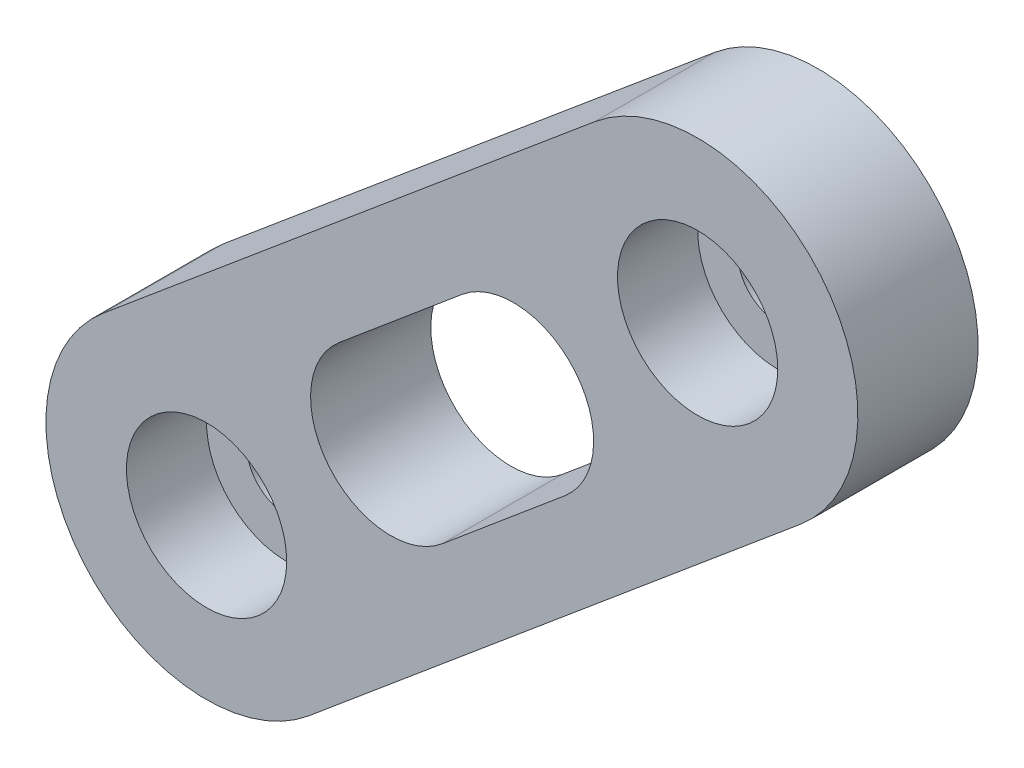
ISO-10303-21;
HEADER;
FILE_DESCRIPTION(('STEP AP214'),'2;1');
FILE_NAME('part.step','',(''),(''),'','','');
FILE_SCHEMA(('AUTOMOTIVE_DESIGN { 1 0 10303 214 1 1 1 1 }'));
ENDSEC;
DATA;
#1=APPLICATION_CONTEXT('core data for automotive mechanical design processes');
#2=APPLICATION_PROTOCOL_DEFINITION('international standard','automotive_design',2000,#1);
#3=PRODUCT_CONTEXT('',#1,'mechanical');
#4=PRODUCT('Part','Part','',(#3));
#5=PRODUCT_RELATED_PRODUCT_CATEGORY('part','',(#4));
#6=PRODUCT_DEFINITION_FORMATION('','',#4);
#7=PRODUCT_DEFINITION_CONTEXT('part definition',#1,'design');
#8=PRODUCT_DEFINITION('design','',#6,#7);
#9=PRODUCT_DEFINITION_SHAPE('','',#8);
#10=(LENGTH_UNIT() NAMED_UNIT(*) SI_UNIT(.MILLI.,.METRE.));
#11=(NAMED_UNIT(*) PLANE_ANGLE_UNIT() SI_UNIT($,.RADIAN.));
#12=(NAMED_UNIT(*) SI_UNIT($,.STERADIAN.) SOLID_ANGLE_UNIT());
#13=UNCERTAINTY_MEASURE_WITH_UNIT(LENGTH_MEASURE(1.E-05),#10,'distance_accuracy_value','');
#14=(GEOMETRIC_REPRESENTATION_CONTEXT(3) GLOBAL_UNCERTAINTY_ASSIGNED_CONTEXT((#13)) GLOBAL_UNIT_ASSIGNED_CONTEXT((#10,
#11,#12)) REPRESENTATION_CONTEXT('',''));
#15=CARTESIAN_POINT('',(0.,0.,0.));
#16=DIRECTION('',(0.,0.,1.));
#17=DIRECTION('',(1.,0.,0.));
#18=AXIS2_PLACEMENT_3D('',#15,#16,#17);
#19=CARTESIAN_POINT('',(432.405497453474,355.964528743967,19.05));
#20=DIRECTION('',(0.,0.,-1.));
#21=DIRECTION('',(-1.,0.,0.));
#22=AXIS2_PLACEMENT_3D('',#19,#20,#21);
#23=CYLINDRICAL_SURFACE('',#22,6.34999999999999);
#24=CARTESIAN_POINT('',(432.405497453474,355.964528743967,0.));
#25=DIRECTION('',(0.,0.,1.));
#26=DIRECTION('',(1.,0.,0.));
#27=AXIS2_PLACEMENT_3D('',#24,#25,#26);
#28=CIRCLE('',#27,6.34999999999999);
#29=CARTESIAN_POINT('',(426.055497453474,355.964528743967,0.));
#30=VERTEX_POINT('',#29);
#31=EDGE_CURVE('E125',#30,#30,#28,.T.);
#32=CARTESIAN_POINT('',(432.405497453474,355.964528743967,6.35));
#33=DIRECTION('',(0.,0.,1.));
#34=DIRECTION('',(1.,0.,0.));
#35=AXIS2_PLACEMENT_3D('',#32,#33,#34);
#36=CIRCLE('',#35,6.34999999999999);
#37=CARTESIAN_POINT('',(426.055497453474,355.964528743967,6.35));
#38=VERTEX_POINT('',#37);
#39=EDGE_CURVE('E43',#38,#38,#36,.T.);
#40=CARTESIAN_POINT('',(426.055497453474,355.964528743967,0.));
#41=CARTESIAN_POINT('',(426.055497453474,355.964528743967,0.0661458333333329));
#42=CARTESIAN_POINT('',(426.055497453474,355.964528743967,0.132291666666666));
#43=CARTESIAN_POINT('',(426.055497453474,355.964528743967,0.264583333333333));
#44=CARTESIAN_POINT('',(426.055497453474,355.964528743967,0.330729166666667));
#45=CARTESIAN_POINT('',(426.055497453474,355.964528743967,0.463020833333334));
#46=CARTESIAN_POINT('',(426.055497453474,355.964528743967,0.529166666666667));
#47=CARTESIAN_POINT('',(426.055497453474,355.964528743967,0.661458333333333));
#48=CARTESIAN_POINT('',(426.055497453474,355.964528743967,0.727604166666666));
#49=CARTESIAN_POINT('',(426.055497453474,355.964528743967,0.859895833333334));
#50=CARTESIAN_POINT('',(426.055497453474,355.964528743967,0.926041666666668));
#51=CARTESIAN_POINT('',(426.055497453474,355.964528743967,1.05833333333333));
#52=CARTESIAN_POINT('',(426.055497453474,355.964528743967,1.12447916666667));
#53=CARTESIAN_POINT('',(426.055497453474,355.964528743967,1.25677083333333));
#54=CARTESIAN_POINT('',(426.055497453474,355.964528743967,1.32291666666667));
#55=CARTESIAN_POINT('',(426.055497453474,355.964528743967,1.45520833333333));
#56=CARTESIAN_POINT('',(426.055497453474,355.964528743967,1.52135416666667));
#57=CARTESIAN_POINT('',(426.055497453474,355.964528743967,1.65364583333333));
#58=CARTESIAN_POINT('',(426.055497453474,355.964528743967,1.71979166666667));
#59=CARTESIAN_POINT('',(426.055497453474,355.964528743967,1.85208333333333));
#60=CARTESIAN_POINT('',(426.055497453474,355.964528743967,1.91822916666667));
#61=CARTESIAN_POINT('',(426.055497453474,355.964528743967,2.05052083333333));
#62=CARTESIAN_POINT('',(426.055497453474,355.964528743967,2.11666666666667));
#63=CARTESIAN_POINT('',(426.055497453474,355.964528743967,2.24895833333333));
#64=CARTESIAN_POINT('',(426.055497453474,355.964528743967,2.31510416666667));
#65=CARTESIAN_POINT('',(426.055497453474,355.964528743967,2.44739583333333));
#66=CARTESIAN_POINT('',(426.055497453474,355.964528743967,2.51354166666667));
#67=CARTESIAN_POINT('',(426.055497453474,355.964528743967,2.64583333333333));
#68=CARTESIAN_POINT('',(426.055497453474,355.964528743967,2.71197916666667));
#69=CARTESIAN_POINT('',(426.055497453474,355.964528743967,2.84427083333333));
#70=CARTESIAN_POINT('',(426.055497453474,355.964528743967,2.91041666666667));
#71=CARTESIAN_POINT('',(426.055497453474,355.964528743967,3.04270833333333));
#72=CARTESIAN_POINT('',(426.055497453474,355.964528743967,3.10885416666667));
#73=CARTESIAN_POINT('',(426.055497453474,355.964528743967,3.24114583333333));
#74=CARTESIAN_POINT('',(426.055497453474,355.964528743967,3.30729166666667));
#75=CARTESIAN_POINT('',(426.055497453474,355.964528743967,3.43958333333333));
#76=CARTESIAN_POINT('',(426.055497453474,355.964528743967,3.50572916666667));
#77=CARTESIAN_POINT('',(426.055497453474,355.964528743967,3.63802083333333));
#78=CARTESIAN_POINT('',(426.055497453474,355.964528743967,3.70416666666667));
#79=CARTESIAN_POINT('',(426.055497453474,355.964528743967,3.83645833333333));
#80=CARTESIAN_POINT('',(426.055497453474,355.964528743967,3.90260416666667));
#81=CARTESIAN_POINT('',(426.055497453474,355.964528743967,4.03489583333333));
#82=CARTESIAN_POINT('',(426.055497453474,355.964528743967,4.10104166666667));
#83=CARTESIAN_POINT('',(426.055497453474,355.964528743967,4.23333333333333));
#84=CARTESIAN_POINT('',(426.055497453474,355.964528743967,4.29947916666667));
#85=CARTESIAN_POINT('',(426.055497453474,355.964528743967,4.43177083333333));
#86=CARTESIAN_POINT('',(426.055497453474,355.964528743967,4.49791666666667));
#87=CARTESIAN_POINT('',(426.055497453474,355.964528743967,4.63020833333333));
#88=CARTESIAN_POINT('',(426.055497453474,355.964528743967,4.69635416666667));
#89=CARTESIAN_POINT('',(426.055497453474,355.964528743967,4.82864583333333));
#90=CARTESIAN_POINT('',(426.055497453474,355.964528743967,4.89479166666667));
#91=CARTESIAN_POINT('',(426.055497453474,355.964528743967,5.02708333333333));
#92=CARTESIAN_POINT('',(426.055497453474,355.964528743967,5.09322916666667));
#93=CARTESIAN_POINT('',(426.055497453474,355.964528743967,5.22552083333333));
#94=CARTESIAN_POINT('',(426.055497453474,355.964528743967,5.29166666666667));
#95=CARTESIAN_POINT('',(426.055497453474,355.964528743967,5.42395833333333));
#96=CARTESIAN_POINT('',(426.055497453474,355.964528743967,5.49010416666667));
#97=CARTESIAN_POINT('',(426.055497453474,355.964528743967,5.62239583333333));
#98=CARTESIAN_POINT('',(426.055497453474,355.964528743967,5.68854166666667));
#99=CARTESIAN_POINT('',(426.055497453474,355.964528743967,5.82083333333333));
#100=CARTESIAN_POINT('',(426.055497453474,355.964528743967,5.88697916666667));
#101=CARTESIAN_POINT('',(426.055497453474,355.964528743967,6.01927083333333));
#102=CARTESIAN_POINT('',(426.055497453474,355.964528743967,6.08541666666667));
#103=CARTESIAN_POINT('',(426.055497453474,355.964528743967,6.21770833333333));
#104=CARTESIAN_POINT('',(426.055497453474,355.964528743967,6.28385416666667));
#105=CARTESIAN_POINT('',(426.055497453474,355.964528743967,6.35));
#106=B_SPLINE_CURVE_WITH_KNOTS('',3,(#40,#41,#42,#43,#44,#45,#46,#47,#48,#49,#50,#51,#52,#53,
#54,#55,#56,#57,#58,#59,#60,#61,#62,#63,#64,#65,#66,#67,#68,#69,#70,#71,#72,#73,#74,#75,#76,#77,
#78,#79,#80,#81,#82,#83,#84,#85,#86,#87,#88,#89,#90,#91,#92,#93,#94,#95,#96,#97,#98,#99,#100,
#101,#102,#103,#104,#105),.UNSPECIFIED.,.F.,.F.,(4,2,2,2,2,2,2,2,2,2,2,2,2,2,2,2,2,2,2,2,2,2,2,
2,2,2,2,2,2,2,2,2,4),(0.,0.198437499999999,0.396875000000001,0.5953125,0.793749999999999,
0.992187500000002,1.190625,1.3890625,1.5875,1.7859375,1.984375,2.1828125,2.38125,2.5796875,
2.778125,2.9765625,3.175,3.3734375,3.571875,3.7703125,3.96875,4.1671875,4.365625,4.5640625,
4.7625,4.9609375,5.159375,5.3578125,5.55625,5.7546875,5.953125,6.1515625,6.35),.UNSPECIFIED.);
#107=EDGE_CURVE('BSEAM39',#30,#38,#106,.T.);
#108=ORIENTED_EDGE('',*,*,#31,.F.);
#109=ORIENTED_EDGE('',*,*,#39,.T.);
#110=ORIENTED_EDGE('',*,*,#107,.T.);
#111=ORIENTED_EDGE('',*,*,#107,.F.);
#112=EDGE_LOOP('',(#108,#110,#109,#111));
#113=FACE_BOUND('',#112,.T.);
#114=ADVANCED_FACE('F39',(#113),#23,.F.);
#115=CARTESIAN_POINT('',(354.575405537633,290.65732732289,19.05));
#116=DIRECTION('',(0.,0.,-1.));
#117=DIRECTION('',(-1.,0.,0.));
#118=AXIS2_PLACEMENT_3D('',#115,#116,#117);
#119=CYLINDRICAL_SURFACE('',#118,6.34999999999999);
#120=CARTESIAN_POINT('',(354.575405537633,290.65732732289,0.));
#121=DIRECTION('',(0.,0.,1.));
#122=DIRECTION('',(1.,0.,0.));
#123=AXIS2_PLACEMENT_3D('',#120,#121,#122);
#124=CIRCLE('',#123,6.34999999999999);
#125=CARTESIAN_POINT('',(348.225405537633,290.65732732289,0.));
#126=VERTEX_POINT('',#125);
#127=EDGE_CURVE('E143',#126,#126,#124,.T.);
#128=CARTESIAN_POINT('',(354.575405537633,290.65732732289,6.35));
#129=DIRECTION('',(0.,0.,1.));
#130=DIRECTION('',(1.,0.,0.));
#131=AXIS2_PLACEMENT_3D('',#128,#129,#130);
#132=CIRCLE('',#131,6.34999999999999);
#133=CARTESIAN_POINT('',(348.225405537633,290.65732732289,6.35));
#134=VERTEX_POINT('',#133);
#135=EDGE_CURVE('E198',#134,#134,#132,.T.);
#136=CARTESIAN_POINT('',(348.225405537633,290.65732732289,0.));
#137=CARTESIAN_POINT('',(348.225405537633,290.65732732289,0.0661458333333329));
#138=CARTESIAN_POINT('',(348.225405537633,290.65732732289,0.132291666666666));
#139=CARTESIAN_POINT('',(348.225405537633,290.65732732289,0.264583333333333));
#140=CARTESIAN_POINT('',(348.225405537633,290.65732732289,0.330729166666667));
#141=CARTESIAN_POINT('',(348.225405537633,290.65732732289,0.463020833333334));
#142=CARTESIAN_POINT('',(348.225405537633,290.65732732289,0.529166666666667));
#143=CARTESIAN_POINT('',(348.225405537633,290.65732732289,0.661458333333333));
#144=CARTESIAN_POINT('',(348.225405537633,290.65732732289,0.727604166666666));
#145=CARTESIAN_POINT('',(348.225405537633,290.65732732289,0.859895833333334));
#146=CARTESIAN_POINT('',(348.225405537633,290.65732732289,0.926041666666668));
#147=CARTESIAN_POINT('',(348.225405537633,290.65732732289,1.05833333333333));
#148=CARTESIAN_POINT('',(348.225405537633,290.65732732289,1.12447916666667));
#149=CARTESIAN_POINT('',(348.225405537633,290.65732732289,1.25677083333333));
#150=CARTESIAN_POINT('',(348.225405537633,290.65732732289,1.32291666666667));
#151=CARTESIAN_POINT('',(348.225405537633,290.65732732289,1.45520833333333));
#152=CARTESIAN_POINT('',(348.225405537633,290.65732732289,1.52135416666667));
#153=CARTESIAN_POINT('',(348.225405537633,290.65732732289,1.65364583333333));
#154=CARTESIAN_POINT('',(348.225405537633,290.65732732289,1.71979166666667));
#155=CARTESIAN_POINT('',(348.225405537633,290.65732732289,1.85208333333333));
#156=CARTESIAN_POINT('',(348.225405537633,290.65732732289,1.91822916666667));
#157=CARTESIAN_POINT('',(348.225405537633,290.65732732289,2.05052083333333));
#158=CARTESIAN_POINT('',(348.225405537633,290.65732732289,2.11666666666667));
#159=CARTESIAN_POINT('',(348.225405537633,290.65732732289,2.24895833333333));
#160=CARTESIAN_POINT('',(348.225405537633,290.65732732289,2.31510416666667));
#161=CARTESIAN_POINT('',(348.225405537633,290.65732732289,2.44739583333333));
#162=CARTESIAN_POINT('',(348.225405537633,290.65732732289,2.51354166666667));
#163=CARTESIAN_POINT('',(348.225405537633,290.65732732289,2.64583333333333));
#164=CARTESIAN_POINT('',(348.225405537633,290.65732732289,2.71197916666667));
#165=CARTESIAN_POINT('',(348.225405537633,290.65732732289,2.84427083333333));
#166=CARTESIAN_POINT('',(348.225405537633,290.65732732289,2.91041666666667));
#167=CARTESIAN_POINT('',(348.225405537633,290.65732732289,3.04270833333333));
#168=CARTESIAN_POINT('',(348.225405537633,290.65732732289,3.10885416666667));
#169=CARTESIAN_POINT('',(348.225405537633,290.65732732289,3.24114583333333));
#170=CARTESIAN_POINT('',(348.225405537633,290.65732732289,3.30729166666667));
#171=CARTESIAN_POINT('',(348.225405537633,290.65732732289,3.43958333333333));
#172=CARTESIAN_POINT('',(348.225405537633,290.65732732289,3.50572916666667));
#173=CARTESIAN_POINT('',(348.225405537633,290.65732732289,3.63802083333333));
#174=CARTESIAN_POINT('',(348.225405537633,290.65732732289,3.70416666666667));
#175=CARTESIAN_POINT('',(348.225405537633,290.65732732289,3.83645833333333));
#176=CARTESIAN_POINT('',(348.225405537633,290.65732732289,3.90260416666667));
#177=CARTESIAN_POINT('',(348.225405537633,290.65732732289,4.03489583333333));
#178=CARTESIAN_POINT('',(348.225405537633,290.65732732289,4.10104166666667));
#179=CARTESIAN_POINT('',(348.225405537633,290.65732732289,4.23333333333333));
#180=CARTESIAN_POINT('',(348.225405537633,290.65732732289,4.29947916666667));
#181=CARTESIAN_POINT('',(348.225405537633,290.65732732289,4.43177083333333));
#182=CARTESIAN_POINT('',(348.225405537633,290.65732732289,4.49791666666667));
#183=CARTESIAN_POINT('',(348.225405537633,290.65732732289,4.63020833333333));
#184=CARTESIAN_POINT('',(348.225405537633,290.65732732289,4.69635416666667));
#185=CARTESIAN_POINT('',(348.225405537633,290.65732732289,4.82864583333333));
#186=CARTESIAN_POINT('',(348.225405537633,290.65732732289,4.89479166666667));
#187=CARTESIAN_POINT('',(348.225405537633,290.65732732289,5.02708333333333));
#188=CARTESIAN_POINT('',(348.225405537633,290.65732732289,5.09322916666667));
#189=CARTESIAN_POINT('',(348.225405537633,290.65732732289,5.22552083333333));
#190=CARTESIAN_POINT('',(348.225405537633,290.65732732289,5.29166666666667));
#191=CARTESIAN_POINT('',(348.225405537633,290.65732732289,5.42395833333333));
#192=CARTESIAN_POINT('',(348.225405537633,290.65732732289,5.49010416666667));
#193=CARTESIAN_POINT('',(348.225405537633,290.65732732289,5.62239583333333));
#194=CARTESIAN_POINT('',(348.225405537633,290.65732732289,5.68854166666667));
#195=CARTESIAN_POINT('',(348.225405537633,290.65732732289,5.82083333333333));
#196=CARTESIAN_POINT('',(348.225405537633,290.65732732289,5.88697916666667));
#197=CARTESIAN_POINT('',(348.225405537633,290.65732732289,6.01927083333333));
#198=CARTESIAN_POINT('',(348.225405537633,290.65732732289,6.08541666666667));
#199=CARTESIAN_POINT('',(348.225405537633,290.65732732289,6.21770833333333));
#200=CARTESIAN_POINT('',(348.225405537633,290.65732732289,6.28385416666667));
#201=CARTESIAN_POINT('',(348.225405537633,290.65732732289,6.35));
#202=B_SPLINE_CURVE_WITH_KNOTS('',3,(#136,#137,#138,#139,#140,#141,#142,#143,#144,#145,#146,
#147,#148,#149,#150,#151,#152,#153,#154,#155,#156,#157,#158,#159,#160,#161,#162,#163,#164,#165,
#166,#167,#168,#169,#170,#171,#172,#173,#174,#175,#176,#177,#178,#179,#180,#181,#182,#183,#184,
#185,#186,#187,#188,#189,#190,#191,#192,#193,#194,#195,#196,#197,#198,#199,#200,#201),
.UNSPECIFIED.,.F.,.F.,(4,2,2,2,2,2,2,2,2,2,2,2,2,2,2,2,2,2,2,2,2,2,2,2,2,2,2,2,2,2,2,2,4),(0.,
0.198437499999999,0.396875000000001,0.5953125,0.793749999999999,0.992187500000002,1.190625,
1.3890625,1.5875,1.7859375,1.984375,2.1828125,2.38125,2.5796875,2.778125,2.9765625,3.175,
3.3734375,3.571875,3.7703125,3.96875,4.1671875,4.365625,4.5640625,4.7625,4.9609375,5.159375,
5.3578125,5.55625,5.7546875,5.953125,6.1515625,6.35),.UNSPECIFIED.);
#203=EDGE_CURVE('BSEAM229',#126,#134,#202,.T.);
#204=ORIENTED_EDGE('',*,*,#127,.F.);
#205=ORIENTED_EDGE('',*,*,#135,.T.);
#206=ORIENTED_EDGE('',*,*,#203,.T.);
#207=ORIENTED_EDGE('',*,*,#203,.F.);
#208=EDGE_LOOP('',(#204,#206,#205,#207));
#209=FACE_BOUND('',#208,.T.);
#210=ADVANCED_FACE('F229',(#209),#119,.F.);
#211=CARTESIAN_POINT('',(354.51118308779,290.734021218523,19.05));
#212=DIRECTION('',(0.,0.,1.));
#213=DIRECTION('',(1.,0.,0.));
#214=AXIS2_PLACEMENT_3D('',#211,#212,#213);
#215=PLANE('',#214);
#216=CARTESIAN_POINT('',(354.575405537633,290.65732732289,19.05));
#217=DIRECTION('',(0.,0.,1.));
#218=DIRECTION('',(1.,0.,0.));
#219=AXIS2_PLACEMENT_3D('',#216,#217,#218);
#220=CIRCLE('',#219,12.7);
#221=CARTESIAN_POINT('',(367.275405537633,290.65732732289,19.05));
#222=VERTEX_POINT('',#221);
#223=EDGE_CURVE('E208',#222,#222,#220,.T.);
#224=ORIENTED_EDGE('',*,*,#223,.F.);
#225=EDGE_LOOP('',(#224));
#226=FACE_BOUND('',#225,.T.);
#227=CARTESIAN_POINT('',(432.405497453474,355.964528743967,19.05));
#228=DIRECTION('',(0.,0.,1.));
#229=DIRECTION('',(1.,0.,0.));
#230=AXIS2_PLACEMENT_3D('',#227,#228,#229);
#231=CIRCLE('',#230,12.7);
#232=CARTESIAN_POINT('',(445.105497453474,355.964528743967,19.05));
#233=VERTEX_POINT('',#232);
#234=EDGE_CURVE('E220',#233,#233,#231,.T.);
#235=ORIENTED_EDGE('',*,*,#234,.F.);
#236=EDGE_LOOP('',(#235));
#237=FACE_BOUND('',#236,.T.);
#238=DIRECTION('',(-0.766044443118981,-0.642787609686536,0.));
#239=VECTOR('',#238,1.);
#240=CARTESIAN_POINT('',(395.055801527622,341.20308524252,19.05));
#241=LINE('',#240,#239);
#242=CARTESIAN_POINT('',(395.055801527622,341.20308524252,19.05));
#243=VERTEX_POINT('',#242);
#244=CARTESIAN_POINT('',(375.5982726724,324.876279956482,19.05));
#245=VERTEX_POINT('',#244);
#246=EDGE_CURVE('E116',#243,#245,#241,.T.);
#247=ORIENTED_EDGE('',*,*,#246,.F.);
#248=CARTESIAN_POINT('',(403.219204170641,331.474320814909,19.05));
#249=DIRECTION('',(0.,0.,1.));
#250=DIRECTION('',(1.,0.,0.));
#251=AXIS2_PLACEMENT_3D('',#248,#249,#250);
#252=CIRCLE('',#251,12.6999999999999);
#253=CARTESIAN_POINT('',(411.38260681366,321.745556387298,19.05));
#254=VERTEX_POINT('',#253);
#255=EDGE_CURVE('E107',#254,#243,#252,.T.);
#256=ORIENTED_EDGE('',*,*,#255,.F.);
#257=DIRECTION('',(0.766044443118977,0.642787609686541,0.));
#258=VECTOR('',#257,1.);
#259=CARTESIAN_POINT('',(411.38260681366,321.745556387298,19.05));
#260=LINE('',#259,#258);
#261=CARTESIAN_POINT('',(391.925077958438,305.41875110126,19.05));
#262=VERTEX_POINT('',#261);
#263=EDGE_CURVE('E135',#262,#254,#260,.T.);
#264=ORIENTED_EDGE('',*,*,#263,.F.);
#265=CARTESIAN_POINT('',(383.761675315419,315.147515528871,19.05));
#266=DIRECTION('',(0.,0.,1.));
#267=DIRECTION('',(1.,0.,0.));
#268=AXIS2_PLACEMENT_3D('',#265,#266,#267);
#269=CIRCLE('',#268,12.7);
#270=EDGE_CURVE('E131',#245,#262,#269,.T.);
#271=ORIENTED_EDGE('',*,*,#270,.F.);
#272=EDGE_LOOP('',(#247,#256,#264,#271));
#273=FACE_BOUND('',#272,.T.);
#274=CARTESIAN_POINT('',(354.51118308779,290.734021218523,19.05));
#275=DIRECTION('',(0.,0.,1.));
#276=DIRECTION('',(1.,0.,0.));
#277=AXIS2_PLACEMENT_3D('',#274,#275,#276);
#278=CIRCLE('',#277,25.4000000000002);
#279=CARTESIAN_POINT('',(338.203539729169,310.207612774476,19.05));
#280=VERTEX_POINT('',#279);
#281=CARTESIAN_POINT('',(370.81882314274,271.260426896001,19.05));
#282=VERTEX_POINT('',#281);
#283=EDGE_CURVE('E163',#280,#282,#278,.T.);
#284=ORIENTED_EDGE('',*,*,#283,.T.);
#285=DIRECTION('',(0.766676941831592,0.642033073029542,0.));
#286=VECTOR('',#285,1.);
#287=CARTESIAN_POINT('',(448.713137508425,336.490934421444,19.05));
#288=LINE('',#287,#286);
#289=CARTESIAN_POINT('',(448.713137508425,336.490934421444,19.05));
#290=VERTEX_POINT('',#289);
#291=EDGE_CURVE('E167',#282,#290,#288,.T.);
#292=ORIENTED_EDGE('',*,*,#291,.T.);
#293=CARTESIAN_POINT('',(432.405497453474,355.964528743967,19.05));
#294=DIRECTION('',(0.,0.,1.));
#295=DIRECTION('',(-1.,0.,0.));
#296=AXIS2_PLACEMENT_3D('',#293,#294,#295);
#297=CIRCLE('',#296,25.4000000000001);
#298=CARTESIAN_POINT('',(416.097857398524,375.438123066489,19.05));
#299=VERTEX_POINT('',#298);
#300=EDGE_CURVE('E171',#290,#299,#297,.T.);
#301=ORIENTED_EDGE('',*,*,#300,.T.);
#302=DIRECTION('',(-0.766676941831591,-0.642033073029543,0.));
#303=VECTOR('',#302,1.);
#304=CARTESIAN_POINT('',(416.097857398524,375.438123066489,19.05));
#305=LINE('',#304,#303);
#306=EDGE_CURVE('E174',#299,#280,#305,.T.);
#307=ORIENTED_EDGE('',*,*,#306,.T.);
#308=EDGE_LOOP('',(#284,#292,#301,#307));
#309=FACE_BOUND('',#308,.T.);
#310=ADVANCED_FACE('F129',(#226,#237,#273,#309),#215,.T.);
#311=CARTESIAN_POINT('',(354.51118308779,290.734021218523,0.));
#312=DIRECTION('',(0.,0.,1.));
#313=DIRECTION('',(1.,0.,0.));
#314=AXIS2_PLACEMENT_3D('',#311,#312,#313);
#315=PLANE('',#314);
#316=ORIENTED_EDGE('',*,*,#31,.T.);
#317=EDGE_LOOP('',(#316));
#318=FACE_BOUND('',#317,.T.);
#319=CARTESIAN_POINT('',(354.51118308779,290.734021218523,0.));
#320=DIRECTION('',(0.,0.,1.));
#321=DIRECTION('',(1.,0.,0.));
#322=AXIS2_PLACEMENT_3D('',#319,#320,#321);
#323=CIRCLE('',#322,25.4000000000002);
#324=CARTESIAN_POINT('',(338.203539729169,310.207612774476,0.));
#325=VERTEX_POINT('',#324);
#326=CARTESIAN_POINT('',(370.81882314274,271.260426896001,0.));
#327=VERTEX_POINT('',#326);
#328=EDGE_CURVE('E162',#325,#327,#323,.T.);
#329=ORIENTED_EDGE('',*,*,#328,.F.);
#330=DIRECTION('',(-0.766676941831591,-0.642033073029543,0.));
#331=VECTOR('',#330,1.);
#332=CARTESIAN_POINT('',(416.097857398524,375.438123066489,0.));
#333=LINE('',#332,#331);
#334=CARTESIAN_POINT('',(416.097857398524,375.438123066489,0.));
#335=VERTEX_POINT('',#334);
#336=EDGE_CURVE('E168',#335,#325,#333,.T.);
#337=ORIENTED_EDGE('',*,*,#336,.F.);
#338=CARTESIAN_POINT('',(432.405497453474,355.964528743967,0.));
#339=DIRECTION('',(0.,0.,1.));
#340=DIRECTION('',(-1.,0.,0.));
#341=AXIS2_PLACEMENT_3D('',#338,#339,#340);
#342=CIRCLE('',#341,25.4000000000001);
#343=CARTESIAN_POINT('',(448.713137508425,336.490934421444,0.));
#344=VERTEX_POINT('',#343);
#345=EDGE_CURVE('E184',#344,#335,#342,.T.);
#346=ORIENTED_EDGE('',*,*,#345,.F.);
#347=DIRECTION('',(0.766676941831592,0.642033073029542,0.));
#348=VECTOR('',#347,1.);
#349=CARTESIAN_POINT('',(448.713137508425,336.490934421444,0.));
#350=LINE('',#349,#348);
#351=EDGE_CURVE('E181',#327,#344,#350,.T.);
#352=ORIENTED_EDGE('',*,*,#351,.F.);
#353=EDGE_LOOP('',(#329,#337,#346,#352));
#354=FACE_BOUND('',#353,.T.);
#355=CARTESIAN_POINT('',(403.219204170641,331.474320814909,0.));
#356=DIRECTION('',(0.,0.,1.));
#357=DIRECTION('',(1.,0.,0.));
#358=AXIS2_PLACEMENT_3D('',#355,#356,#357);
#359=CIRCLE('',#358,12.6999999999999);
#360=CARTESIAN_POINT('',(411.38260681366,321.745556387298,0.));
#361=VERTEX_POINT('',#360);
#362=CARTESIAN_POINT('',(395.055801527622,341.20308524252,0.));
#363=VERTEX_POINT('',#362);
#364=EDGE_CURVE('E65',#361,#363,#359,.T.);
#365=ORIENTED_EDGE('',*,*,#364,.T.);
#366=DIRECTION('',(-0.766044443118981,-0.642787609686536,0.));
#367=VECTOR('',#366,1.);
#368=CARTESIAN_POINT('',(395.055801527622,341.20308524252,0.));
#369=LINE('',#368,#367);
#370=CARTESIAN_POINT('',(375.5982726724,324.876279956482,0.));
#371=VERTEX_POINT('',#370);
#372=EDGE_CURVE('E123',#363,#371,#369,.T.);
#373=ORIENTED_EDGE('',*,*,#372,.T.);
#374=CARTESIAN_POINT('',(383.761675315419,315.147515528871,0.));
#375=DIRECTION('',(0.,0.,1.));
#376=DIRECTION('',(1.,0.,0.));
#377=AXIS2_PLACEMENT_3D('',#374,#375,#376);
#378=CIRCLE('',#377,12.7);
#379=CARTESIAN_POINT('',(391.925077958438,305.41875110126,0.));
#380=VERTEX_POINT('',#379);
#381=EDGE_CURVE('E146',#371,#380,#378,.T.);
#382=ORIENTED_EDGE('',*,*,#381,.T.);
#383=DIRECTION('',(0.766044443118977,0.642787609686541,0.));
#384=VECTOR('',#383,1.);
#385=CARTESIAN_POINT('',(411.38260681366,321.745556387298,0.));
#386=LINE('',#385,#384);
#387=EDGE_CURVE('E117',#380,#361,#386,.T.);
#388=ORIENTED_EDGE('',*,*,#387,.T.);
#389=EDGE_LOOP('',(#365,#373,#382,#388));
#390=FACE_BOUND('',#389,.T.);
#391=ORIENTED_EDGE('',*,*,#127,.T.);
#392=EDGE_LOOP('',(#391));
#393=FACE_BOUND('',#392,.T.);
#394=ADVANCED_FACE('F227',(#318,#354,#390,#393),#315,.F.);
#395=CARTESIAN_POINT('',(354.51118308779,290.734021218523,19.05));
#396=DIRECTION('',(0.,0.,-1.));
#397=DIRECTION('',(-1.,0.,0.));
#398=AXIS2_PLACEMENT_3D('',#395,#396,#397);
#399=CYLINDRICAL_SURFACE('',#398,25.4000000000002);
#400=ORIENTED_EDGE('',*,*,#328,.T.);
#401=DIRECTION('',(0.,0.,-1.));
#402=VECTOR('',#401,1.);
#403=CARTESIAN_POINT('',(370.81882314274,271.260426896001,19.05));
#404=LINE('',#403,#402);
#405=EDGE_CURVE('E11',#282,#327,#404,.T.);
#406=ORIENTED_EDGE('',*,*,#405,.F.);
#407=ORIENTED_EDGE('',*,*,#283,.F.);
#408=DIRECTION('',(0.,0.,-1.));
#409=VECTOR('',#408,1.);
#410=CARTESIAN_POINT('',(338.203539729169,310.207612774476,19.05));
#411=LINE('',#410,#409);
#412=EDGE_CURVE('E177',#280,#325,#411,.T.);
#413=ORIENTED_EDGE('',*,*,#412,.T.);
#414=EDGE_LOOP('',(#400,#406,#407,#413));
#415=FACE_BOUND('',#414,.T.);
#416=ADVANCED_FACE('F41',(#415),#399,.T.);
#417=CARTESIAN_POINT('',(448.713137508425,336.490934421444,19.05));
#418=DIRECTION('',(-0.642033073029542,0.766676941831592,0.));
#419=DIRECTION('',(-0.766676941831592,-0.642033073029542,0.));
#420=AXIS2_PLACEMENT_3D('',#417,#418,#419);
#421=PLANE('',#420);
#422=ORIENTED_EDGE('',*,*,#351,.T.);
#423=DIRECTION('',(0.,0.,-1.));
#424=VECTOR('',#423,1.);
#425=CARTESIAN_POINT('',(448.713137508425,336.490934421444,19.05));
#426=LINE('',#425,#424);
#427=EDGE_CURVE('E49',#290,#344,#426,.T.);
#428=ORIENTED_EDGE('',*,*,#427,.F.);
#429=ORIENTED_EDGE('',*,*,#291,.F.);
#430=ORIENTED_EDGE('',*,*,#405,.T.);
#431=EDGE_LOOP('',(#422,#428,#429,#430));
#432=FACE_BOUND('',#431,.T.);
#433=ADVANCED_FACE('F265',(#432),#421,.F.);
#434=CARTESIAN_POINT('',(432.405497453474,355.964528743967,19.05));
#435=DIRECTION('',(0.,0.,-1.));
#436=DIRECTION('',(-1.,0.,0.));
#437=AXIS2_PLACEMENT_3D('',#434,#435,#436);
#438=CYLINDRICAL_SURFACE('',#437,25.4000000000001);
#439=ORIENTED_EDGE('',*,*,#345,.T.);
#440=DIRECTION('',(0.,0.,-1.));
#441=VECTOR('',#440,1.);
#442=CARTESIAN_POINT('',(416.097857398524,375.438123066489,19.05));
#443=LINE('',#442,#441);
#444=EDGE_CURVE('E192',#299,#335,#443,.T.);
#445=ORIENTED_EDGE('',*,*,#444,.F.);
#446=ORIENTED_EDGE('',*,*,#300,.F.);
#447=ORIENTED_EDGE('',*,*,#427,.T.);
#448=EDGE_LOOP('',(#439,#445,#446,#447));
#449=FACE_BOUND('',#448,.T.);
#450=ADVANCED_FACE('F262',(#449),#438,.T.);
#451=CARTESIAN_POINT('',(416.097857398524,375.438123066489,19.05));
#452=DIRECTION('',(0.642033073029543,-0.766676941831591,0.));
#453=DIRECTION('',(0.766676941831591,0.642033073029543,0.));
#454=AXIS2_PLACEMENT_3D('',#451,#452,#453);
#455=PLANE('',#454);
#456=ORIENTED_EDGE('',*,*,#336,.T.);
#457=ORIENTED_EDGE('',*,*,#412,.F.);
#458=ORIENTED_EDGE('',*,*,#306,.F.);
#459=ORIENTED_EDGE('',*,*,#444,.T.);
#460=EDGE_LOOP('',(#456,#457,#458,#459));
#461=FACE_BOUND('',#460,.T.);
#462=ADVANCED_FACE('F255',(#461),#455,.F.);
#463=CARTESIAN_POINT('',(403.219204170641,331.474320814909,19.05));
#464=DIRECTION('',(0.,0.,-1.));
#465=DIRECTION('',(-1.,0.,0.));
#466=AXIS2_PLACEMENT_3D('',#463,#464,#465);
#467=CYLINDRICAL_SURFACE('',#466,12.6999999999999);
#468=ORIENTED_EDGE('',*,*,#364,.F.);
#469=DIRECTION('',(0.,0.,-1.));
#470=VECTOR('',#469,1.);
#471=CARTESIAN_POINT('',(411.38260681366,321.745556387298,19.05));
#472=LINE('',#471,#470);
#473=EDGE_CURVE('E111',#254,#361,#472,.T.);
#474=ORIENTED_EDGE('',*,*,#473,.F.);
#475=ORIENTED_EDGE('',*,*,#255,.T.);
#476=DIRECTION('',(0.,0.,-1.));
#477=VECTOR('',#476,1.);
#478=CARTESIAN_POINT('',(395.055801527622,341.20308524252,19.05));
#479=LINE('',#478,#477);
#480=EDGE_CURVE('E110',#243,#363,#479,.T.);
#481=ORIENTED_EDGE('',*,*,#480,.T.);
#482=EDGE_LOOP('',(#468,#474,#475,#481));
#483=FACE_BOUND('',#482,.T.);
#484=ADVANCED_FACE('F109',(#483),#467,.F.);
#485=CARTESIAN_POINT('',(395.055801527622,341.20308524252,19.05));
#486=DIRECTION('',(0.642787609686536,-0.766044443118981,0.));
#487=DIRECTION('',(0.766044443118981,0.642787609686536,0.));
#488=AXIS2_PLACEMENT_3D('',#485,#486,#487);
#489=PLANE('',#488);
#490=ORIENTED_EDGE('',*,*,#372,.F.);
#491=ORIENTED_EDGE('',*,*,#480,.F.);
#492=ORIENTED_EDGE('',*,*,#246,.T.);
#493=DIRECTION('',(0.,0.,-1.));
#494=VECTOR('',#493,1.);
#495=CARTESIAN_POINT('',(375.5982726724,324.876279956482,19.05));
#496=LINE('',#495,#494);
#497=EDGE_CURVE('E126',#245,#371,#496,.T.);
#498=ORIENTED_EDGE('',*,*,#497,.T.);
#499=EDGE_LOOP('',(#490,#491,#492,#498));
#500=FACE_BOUND('',#499,.T.);
#501=ADVANCED_FACE('F120',(#500),#489,.T.);
#502=CARTESIAN_POINT('',(383.761675315419,315.147515528871,19.05));
#503=DIRECTION('',(0.,0.,-1.));
#504=DIRECTION('',(-1.,0.,0.));
#505=AXIS2_PLACEMENT_3D('',#502,#503,#504);
#506=CYLINDRICAL_SURFACE('',#505,12.7);
#507=ORIENTED_EDGE('',*,*,#381,.F.);
#508=ORIENTED_EDGE('',*,*,#497,.F.);
#509=ORIENTED_EDGE('',*,*,#270,.T.);
#510=DIRECTION('',(0.,0.,-1.));
#511=VECTOR('',#510,1.);
#512=CARTESIAN_POINT('',(391.925077958438,305.41875110126,19.05));
#513=LINE('',#512,#511);
#514=EDGE_CURVE('E57',#262,#380,#513,.T.);
#515=ORIENTED_EDGE('',*,*,#514,.T.);
#516=EDGE_LOOP('',(#507,#508,#509,#515));
#517=FACE_BOUND('',#516,.T.);
#518=ADVANCED_FACE('F248',(#517),#506,.F.);
#519=CARTESIAN_POINT('',(411.38260681366,321.745556387298,19.05));
#520=DIRECTION('',(-0.642787609686541,0.766044443118977,0.));
#521=DIRECTION('',(-0.766044443118977,-0.642787609686541,0.));
#522=AXIS2_PLACEMENT_3D('',#519,#520,#521);
#523=PLANE('',#522);
#524=ORIENTED_EDGE('',*,*,#387,.F.);
#525=ORIENTED_EDGE('',*,*,#514,.F.);
#526=ORIENTED_EDGE('',*,*,#263,.T.);
#527=ORIENTED_EDGE('',*,*,#473,.T.);
#528=EDGE_LOOP('',(#524,#525,#526,#527));
#529=FACE_BOUND('',#528,.T.);
#530=ADVANCED_FACE('F244',(#529),#523,.T.);
#531=CARTESIAN_POINT('',(354.575405537633,290.65732732289,6.35));
#532=DIRECTION('',(0.,0.,1.));
#533=DIRECTION('',(1.,0.,0.));
#534=AXIS2_PLACEMENT_3D('',#531,#532,#533);
#535=CYLINDRICAL_SURFACE('',#534,12.7);
#536=CARTESIAN_POINT('',(354.575405537633,290.65732732289,6.35));
#537=DIRECTION('',(0.,0.,1.));
#538=DIRECTION('',(1.,0.,0.));
#539=AXIS2_PLACEMENT_3D('',#536,#537,#538);
#540=CIRCLE('',#539,12.7);
#541=CARTESIAN_POINT('',(367.275405537633,290.65732732289,6.35));
#542=VERTEX_POINT('',#541);
#543=EDGE_CURVE('E201',#542,#542,#540,.T.);
#544=ORIENTED_EDGE('',*,*,#543,.F.);
#545=EDGE_LOOP('',(#544));
#546=FACE_BOUND('',#545,.T.);
#547=ORIENTED_EDGE('',*,*,#223,.T.);
#548=EDGE_LOOP('',(#547));
#549=FACE_BOUND('',#548,.T.);
#550=ADVANCED_FACE('F247',(#546,#549),#535,.F.);
#551=CARTESIAN_POINT('',(354.575405537633,290.65732732289,6.35));
#552=DIRECTION('',(0.,0.,1.));
#553=DIRECTION('',(1.,0.,0.));
#554=AXIS2_PLACEMENT_3D('',#551,#552,#553);
#555=PLANE('',#554);
#556=ORIENTED_EDGE('',*,*,#135,.F.);
#557=EDGE_LOOP('',(#556));
#558=FACE_BOUND('',#557,.T.);
#559=ORIENTED_EDGE('',*,*,#543,.T.);
#560=EDGE_LOOP('',(#559));
#561=FACE_BOUND('',#560,.T.);
#562=ADVANCED_FACE('F308',(#558,#561),#555,.T.);
#563=CARTESIAN_POINT('',(432.405497453474,355.964528743967,6.35));
#564=DIRECTION('',(0.,0.,1.));
#565=DIRECTION('',(1.,0.,0.));
#566=AXIS2_PLACEMENT_3D('',#563,#564,#565);
#567=CYLINDRICAL_SURFACE('',#566,12.7);
#568=CARTESIAN_POINT('',(432.405497453474,355.964528743967,6.35));
#569=DIRECTION('',(0.,0.,1.));
#570=DIRECTION('',(1.,0.,0.));
#571=AXIS2_PLACEMENT_3D('',#568,#569,#570);
#572=CIRCLE('',#571,12.7);
#573=CARTESIAN_POINT('',(445.105497453474,355.964528743967,6.35));
#574=VERTEX_POINT('',#573);
#575=EDGE_CURVE('E214',#574,#574,#572,.T.);
#576=ORIENTED_EDGE('',*,*,#575,.F.);
#577=EDGE_LOOP('',(#576));
#578=FACE_BOUND('',#577,.T.);
#579=ORIENTED_EDGE('',*,*,#234,.T.);
#580=EDGE_LOOP('',(#579));
#581=FACE_BOUND('',#580,.T.);
#582=ADVANCED_FACE('F242',(#578,#581),#567,.F.);
#583=CARTESIAN_POINT('',(432.405497453474,355.964528743967,6.35));
#584=DIRECTION('',(0.,0.,1.));
#585=DIRECTION('',(1.,0.,0.));
#586=AXIS2_PLACEMENT_3D('',#583,#584,#585);
#587=PLANE('',#586);
#588=ORIENTED_EDGE('',*,*,#39,.F.);
#589=EDGE_LOOP('',(#588));
#590=FACE_BOUND('',#589,.T.);
#591=ORIENTED_EDGE('',*,*,#575,.T.);
#592=EDGE_LOOP('',(#591));
#593=FACE_BOUND('',#592,.T.);
#594=ADVANCED_FACE('F328',(#590,#593),#587,.T.);
#595=CLOSED_SHELL('',(#114,#210,#310,#394,#416,#433,#450,#462,#484,#501,#518,#530,#550,#562,
#582,#594));
#596=MANIFOLD_SOLID_BREP('B2',#595);
#597=ADVANCED_BREP_SHAPE_REPRESENTATION('',(#18,#596),#14);
#598=SHAPE_DEFINITION_REPRESENTATION(#9,#597);
ENDSEC;
END-ISO-10303-21;
